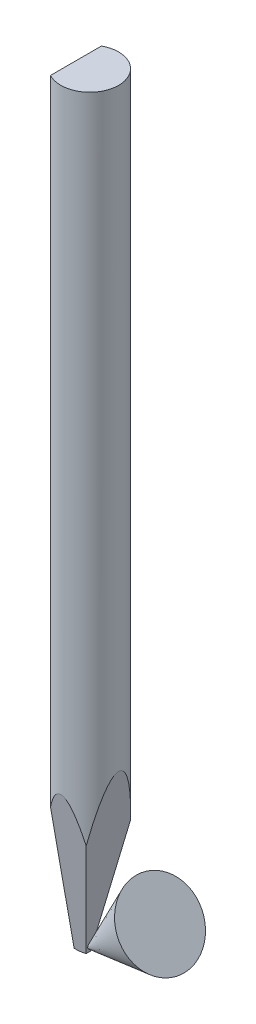
ISO-10303-21;
HEADER;
FILE_DESCRIPTION(('STEP AP214'),'2;1');
FILE_NAME('part.step','',(''),(''),'','','');
FILE_SCHEMA(('AUTOMOTIVE_DESIGN { 1 0 10303 214 1 1 1 1 }'));
ENDSEC;
DATA;
#1=APPLICATION_CONTEXT('core data for automotive mechanical design processes');
#2=APPLICATION_PROTOCOL_DEFINITION('international standard','automotive_design',2000,#1);
#3=PRODUCT_CONTEXT('',#1,'mechanical');
#4=PRODUCT('Part','Part','',(#3));
#5=PRODUCT_RELATED_PRODUCT_CATEGORY('part','',(#4));
#6=PRODUCT_DEFINITION_FORMATION('','',#4);
#7=PRODUCT_DEFINITION_CONTEXT('part definition',#1,'design');
#8=PRODUCT_DEFINITION('design','',#6,#7);
#9=PRODUCT_DEFINITION_SHAPE('','',#8);
#10=(LENGTH_UNIT() NAMED_UNIT(*) SI_UNIT(.MILLI.,.METRE.));
#11=(NAMED_UNIT(*) PLANE_ANGLE_UNIT() SI_UNIT($,.RADIAN.));
#12=(NAMED_UNIT(*) SI_UNIT($,.STERADIAN.) SOLID_ANGLE_UNIT());
#13=UNCERTAINTY_MEASURE_WITH_UNIT(LENGTH_MEASURE(1.E-05),#10,'distance_accuracy_value','');
#14=(GEOMETRIC_REPRESENTATION_CONTEXT(3) GLOBAL_UNCERTAINTY_ASSIGNED_CONTEXT((#13)) GLOBAL_UNIT_ASSIGNED_CONTEXT((#10,
#11,#12)) REPRESENTATION_CONTEXT('',''));
#15=CARTESIAN_POINT('',(0.,0.,0.));
#16=DIRECTION('',(0.,0.,1.));
#17=DIRECTION('',(1.,0.,0.));
#18=AXIS2_PLACEMENT_3D('',#15,#16,#17);
#19=CARTESIAN_POINT('',(-0.200697368462363,0.0863600000000001,0.));
#20=DIRECTION('',(-0.529919264233209,-0.848048096156424,0.));
#21=DIRECTION('',(0.848048096156424,-0.529919264233209,0.));
#22=AXIS2_PLACEMENT_3D('',#19,#20,#21);
#23=CYLINDRICAL_SURFACE('',#22,0.03175);
#24=DIRECTION('',(-0.529919264233209,-0.848048096156424,0.));
#25=VECTOR('',#24,1.);
#26=CARTESIAN_POINT('',(-0.183148578935577,0.11444393382259,0.03175));
#27=LINE('',#26,#25);
#28=CARTESIAN_POINT('',(-0.200697368462363,0.0863600000000001,0.03175));
#29=VERTEX_POINT('',#28);
#30=CARTESIAN_POINT('',(-0.254661085693253,0.,0.03175));
#31=VERTEX_POINT('',#30);
#32=EDGE_CURVE('E130',#29,#31,#27,.T.);
#33=ORIENTED_EDGE('',*,*,#32,.F.);
#34=CARTESIAN_POINT('',(-0.200697368462363,0.0863600000000001,0.));
#35=DIRECTION('',(0.,-1.,0.));
#36=DIRECTION('',(-1.,0.,0.));
#37=AXIS2_PLACEMENT_3D('',#34,#35,#36);
#38=ELLIPSE('',#37,0.0374389143067467,0.03175);
#39=CARTESIAN_POINT('',(-0.200697368462363,0.0863600000000001,-0.03175));
#40=VERTEX_POINT('',#39);
#41=EDGE_CURVE('E61',#40,#29,#38,.F.);
#42=ORIENTED_EDGE('',*,*,#41,.F.);
#43=DIRECTION('',(0.529919264233209,0.848048096156424,0.));
#44=VECTOR('',#43,1.);
#45=CARTESIAN_POINT('',(-0.200697368462363,0.0863600000000001,-0.03175));
#46=LINE('',#45,#44);
#47=CARTESIAN_POINT('',(-0.254661085693253,0.,-0.03175));
#48=VERTEX_POINT('',#47);
#49=EDGE_CURVE('E133',#48,#40,#46,.T.);
#50=ORIENTED_EDGE('',*,*,#49,.F.);
#51=CARTESIAN_POINT('',(-0.254661085693253,0.,0.));
#52=DIRECTION('',(0.,1.,0.));
#53=DIRECTION('',(-1.,0.,0.));
#54=AXIS2_PLACEMENT_3D('',#51,#52,#53);
#55=ELLIPSE('',#54,0.0374389143067467,0.03175);
#56=EDGE_CURVE('E12',#31,#48,#55,.F.);
#57=ORIENTED_EDGE('',*,*,#56,.F.);
#58=EDGE_LOOP('',(#33,#42,#50,#57));
#59=FACE_BOUND('',#58,.T.);
#60=ADVANCED_FACE('F53',(#59),#23,.T.);
#61=CARTESIAN_POINT('',(-0.23813628276911,0.0863600000000001,0.03175));
#62=DIRECTION('',(0.,-1.,0.));
#63=DIRECTION('',(0.,0.,-1.));
#64=AXIS2_PLACEMENT_3D('',#61,#62,#63);
#65=PLANE('',#64);
#66=DIRECTION('',(-1.,0.,0.));
#67=VECTOR('',#66,1.);
#68=CARTESIAN_POINT('',(-0.23813628276911,0.0863600000000001,-0.03175));
#69=LINE('',#68,#67);
#70=CARTESIAN_POINT('',(-0.13716,0.0863600000000001,-0.03175));
#71=VERTEX_POINT('',#70);
#72=EDGE_CURVE('E105',#71,#40,#69,.T.);
#73=ORIENTED_EDGE('',*,*,#72,.T.);
#74=ORIENTED_EDGE('',*,*,#41,.T.);
#75=DIRECTION('',(-1.,0.,0.));
#76=VECTOR('',#75,1.);
#77=CARTESIAN_POINT('',(-0.23813628276911,0.0863600000000001,0.03175));
#78=LINE('',#77,#76);
#79=CARTESIAN_POINT('',(-0.13716,0.0863600000000001,0.03175));
#80=VERTEX_POINT('',#79);
#81=EDGE_CURVE('E135',#80,#29,#78,.T.);
#82=ORIENTED_EDGE('',*,*,#81,.F.);
#83=DIRECTION('',(0.,0.,-1.));
#84=VECTOR('',#83,1.);
#85=CARTESIAN_POINT('',(-0.13716,0.0863600000000001,0.03175));
#86=LINE('',#85,#84);
#87=CARTESIAN_POINT('',(-0.13716,0.0863600000000001,0.0253999999999999));
#88=VERTEX_POINT('',#87);
#89=EDGE_CURVE('E113',#80,#88,#86,.T.);
#90=ORIENTED_EDGE('',*,*,#89,.T.);
#91=CARTESIAN_POINT('',(-0.13716,0.0863600000000001,0.));
#92=DIRECTION('',(0.,1.,0.));
#93=DIRECTION('',(1.,0.,0.));
#94=AXIS2_PLACEMENT_3D('',#91,#92,#93);
#95=ELLIPSE('',#94,0.0412564388352619,0.0253999999999999);
#96=CARTESIAN_POINT('',(-0.13716,0.0863600000000001,-0.0253999999999983));
#97=VERTEX_POINT('',#96);
#98=EDGE_CURVE('E100',#88,#97,#95,.F.);
#99=ORIENTED_EDGE('',*,*,#98,.T.);
#100=EDGE_CURVE('E110',#97,#71,#86,.T.);
#101=ORIENTED_EDGE('',*,*,#100,.T.);
#102=EDGE_LOOP('',(#73,#74,#82,#90,#99,#101));
#103=FACE_BOUND('',#102,.T.);
#104=ADVANCED_FACE('F109',(#103),#65,.F.);
#105=CARTESIAN_POINT('',(-0.13716,0.,0.03175));
#106=DIRECTION('',(0.,1.,0.));
#107=DIRECTION('',(0.,0.,1.));
#108=AXIS2_PLACEMENT_3D('',#105,#106,#107);
#109=PLANE('',#108);
#110=DIRECTION('',(1.,0.,0.));
#111=VECTOR('',#110,1.);
#112=CARTESIAN_POINT('',(-0.13716,0.,0.03175));
#113=LINE('',#112,#111);
#114=CARTESIAN_POINT('',(-0.13716,0.,0.03175));
#115=VERTEX_POINT('',#114);
#116=EDGE_CURVE('E124',#31,#115,#113,.T.);
#117=ORIENTED_EDGE('',*,*,#116,.F.);
#118=ORIENTED_EDGE('',*,*,#56,.T.);
#119=DIRECTION('',(1.,0.,0.));
#120=VECTOR('',#119,1.);
#121=CARTESIAN_POINT('',(-0.13716,0.,-0.03175));
#122=LINE('',#121,#120);
#123=CARTESIAN_POINT('',(-0.13716,0.,-0.03175));
#124=VERTEX_POINT('',#123);
#125=EDGE_CURVE('E141',#48,#124,#122,.T.);
#126=ORIENTED_EDGE('',*,*,#125,.T.);
#127=DIRECTION('',(0.,0.,-1.));
#128=VECTOR('',#127,1.);
#129=CARTESIAN_POINT('',(-0.13716,0.,0.03175));
#130=LINE('',#129,#128);
#131=EDGE_CURVE('E123',#115,#124,#130,.T.);
#132=ORIENTED_EDGE('',*,*,#131,.F.);
#133=EDGE_LOOP('',(#117,#118,#126,#132));
#134=FACE_BOUND('',#133,.T.);
#135=ADVANCED_FACE('F145',(#134),#109,.F.);
#136=CARTESIAN_POINT('',(-0.13716,0.0863600000000001,0.03175));
#137=DIRECTION('',(-1.,0.,0.));
#138=DIRECTION('',(0.,0.,1.));
#139=AXIS2_PLACEMENT_3D('',#136,#137,#138);
#140=PLANE('',#139);
#141=ORIENTED_EDGE('',*,*,#100,.F.);
#142=CARTESIAN_POINT('',(-0.13716,0.08636,0.));
#143=DIRECTION('',(1.,0.,0.));
#144=DIRECTION('',(0.,1.,0.));
#145=AXIS2_PLACEMENT_3D('',#142,#143,#144);
#146=ELLIPSE('',#145,0.0322330626628433,0.0253999999999999);
#147=EDGE_CURVE('E96',#97,#88,#146,.F.);
#148=ORIENTED_EDGE('',*,*,#147,.T.);
#149=ORIENTED_EDGE('',*,*,#89,.F.);
#150=DIRECTION('',(0.,1.,0.));
#151=VECTOR('',#150,1.);
#152=CARTESIAN_POINT('',(-0.13716,0.0863600000000001,0.03175));
#153=LINE('',#152,#151);
#154=EDGE_CURVE('E121',#115,#80,#153,.T.);
#155=ORIENTED_EDGE('',*,*,#154,.F.);
#156=ORIENTED_EDGE('',*,*,#131,.T.);
#157=DIRECTION('',(0.,1.,0.));
#158=VECTOR('',#157,1.);
#159=CARTESIAN_POINT('',(-0.13716,0.0863600000000001,-0.03175));
#160=LINE('',#159,#158);
#161=EDGE_CURVE('E119',#124,#71,#160,.T.);
#162=ORIENTED_EDGE('',*,*,#161,.T.);
#163=EDGE_LOOP('',(#141,#148,#149,#155,#156,#162));
#164=FACE_BOUND('',#163,.T.);
#165=ADVANCED_FACE('F116',(#164),#140,.F.);
#166=CARTESIAN_POINT('',(0.,0.,0.03175));
#167=DIRECTION('',(0.,0.,-1.));
#168=DIRECTION('',(-1.,0.,0.));
#169=AXIS2_PLACEMENT_3D('',#166,#167,#168);
#170=PLANE('',#169);
#171=ORIENTED_EDGE('',*,*,#81,.T.);
#172=ORIENTED_EDGE('',*,*,#32,.T.);
#173=ORIENTED_EDGE('',*,*,#116,.T.);
#174=ORIENTED_EDGE('',*,*,#154,.T.);
#175=EDGE_LOOP('',(#171,#172,#173,#174));
#176=FACE_BOUND('',#175,.T.);
#177=ADVANCED_FACE('F137',(#176),#170,.F.);
#178=CARTESIAN_POINT('',(0.,0.,-0.03175));
#179=DIRECTION('',(0.,0.,-1.));
#180=DIRECTION('',(-1.,0.,0.));
#181=AXIS2_PLACEMENT_3D('',#178,#179,#180);
#182=PLANE('',#181);
#183=ORIENTED_EDGE('',*,*,#125,.F.);
#184=ORIENTED_EDGE('',*,*,#49,.T.);
#185=ORIENTED_EDGE('',*,*,#72,.F.);
#186=ORIENTED_EDGE('',*,*,#161,.F.);
#187=EDGE_LOOP('',(#183,#184,#185,#186));
#188=FACE_BOUND('',#187,.T.);
#189=ADVANCED_FACE('F147',(#188),#182,.T.);
#190=CARTESIAN_POINT('',(-0.321978727638829,-0.0580362154134752,0.));
#191=DIRECTION('',(0.788010753606725,0.615661475325654,0.));
#192=DIRECTION('',(-0.615661475325654,0.788010753606725,0.));
#193=AXIS2_PLACEMENT_3D('',#190,#191,#192);
#194=CYLINDRICAL_SURFACE('',#193,0.0253999999999999);
#195=ORIENTED_EDGE('',*,*,#147,.F.);
#196=ORIENTED_EDGE('',*,*,#98,.F.);
#197=EDGE_LOOP('',(#195,#196));
#198=FACE_BOUND('',#197,.T.);
#199=CARTESIAN_POINT('',(-0.04377893297405,0.159317285455234,0.));
#200=DIRECTION('',(0.788010753606725,0.615661475325654,0.));
#201=DIRECTION('',(-0.615661475325654,0.788010753606725,0.));
#202=AXIS2_PLACEMENT_3D('',#199,#200,#201);
#203=CIRCLE('',#202,0.0253999999999999);
#204=CARTESIAN_POINT('',(-0.0594167344473216,0.179332758596845,0.));
#205=VERTEX_POINT('',#204);
#206=EDGE_CURVE('E114',#205,#205,#203,.T.);
#207=ORIENTED_EDGE('',*,*,#206,.F.);
#208=EDGE_LOOP('',(#207));
#209=FACE_BOUND('',#208,.T.);
#210=ADVANCED_FACE('F98',(#198,#209),#194,.T.);
#211=CARTESIAN_POINT('',(-0.04377893297405,0.159317285455234,0.));
#212=DIRECTION('',(0.788010753606725,0.615661475325654,0.));
#213=DIRECTION('',(-0.615661475325654,0.788010753606725,0.));
#214=AXIS2_PLACEMENT_3D('',#211,#212,#213);
#215=CONICAL_SURFACE('',#214,0.0253999999999999,0.392699081698725);
#216=CARTESIAN_POINT('',(1.926244010989,1.69846789546199,0.));
#217=DIRECTION('',(0.788010753606725,0.615661475325654,0.));
#218=DIRECTION('',(-0.615661475325654,0.788010753606725,0.));
#219=AXIS2_PLACEMENT_3D('',#216,#217,#218);
#220=CIRCLE('',#219,1.06093183486493);
#221=CARTESIAN_POINT('',(1.2730691523161,2.53449359017927,0.));
#222=VERTEX_POINT('',#221);
#223=EDGE_CURVE('E244',#222,#222,#220,.T.);
#224=CARTESIAN_POINT('',(1.2730691523161,2.53449359017927,0.));
#225=CARTESIAN_POINT('',(1.25918909099565,2.50996066485029,0.));
#226=CARTESIAN_POINT('',(1.2453090296752,2.4854277395213,0.));
#227=CARTESIAN_POINT('',(1.21754890703429,2.43636188886334,0.));
#228=CARTESIAN_POINT('',(1.20366884571384,2.41182896353435,0.));
#229=CARTESIAN_POINT('',(1.17590872307293,2.36276311287639,0.));
#230=CARTESIAN_POINT('',(1.16202866175248,2.3382301875474,0.));
#231=CARTESIAN_POINT('',(1.13426853911158,2.28916433688944,0.));
#232=CARTESIAN_POINT('',(1.12038847779112,2.26463141156045,0.));
#233=CARTESIAN_POINT('',(1.09262835515022,2.21556556090248,0.));
#234=CARTESIAN_POINT('',(1.07874829382977,2.1910326355735,0.));
#235=CARTESIAN_POINT('',(1.05098817118886,2.14196678491553,0.));
#236=CARTESIAN_POINT('',(1.03710810986841,2.11743385958655,0.));
#237=CARTESIAN_POINT('',(1.00934798722751,2.06836800892858,0.));
#238=CARTESIAN_POINT('',(0.995467925907054,2.0438350835996,0.));
#239=CARTESIAN_POINT('',(0.96770780326615,1.99476923294163,0.));
#240=CARTESIAN_POINT('',(0.953827741945697,1.97023630761265,0.));
#241=CARTESIAN_POINT('',(0.926067619304793,1.92117045695468,0.));
#242=CARTESIAN_POINT('',(0.91218755798434,1.8966375316257,0.));
#243=CARTESIAN_POINT('',(0.884427435343435,1.84757168096773,0.));
#244=CARTESIAN_POINT('',(0.870547374022983,1.82303875563875,0.));
#245=CARTESIAN_POINT('',(0.842787251382079,1.77397290498078,0.));
#246=CARTESIAN_POINT('',(0.828907190061626,1.7494399796518,0.));
#247=CARTESIAN_POINT('',(0.801147067420722,1.70037412899383,0.));
#248=CARTESIAN_POINT('',(0.787267006100269,1.67584120366485,0.));
#249=CARTESIAN_POINT('',(0.759506883459365,1.62677535300688,0.));
#250=CARTESIAN_POINT('',(0.745626822138913,1.60224242767789,0.));
#251=CARTESIAN_POINT('',(0.717866699498008,1.55317657701993,0.));
#252=CARTESIAN_POINT('',(0.703986638177555,1.52864365169094,0.));
#253=CARTESIAN_POINT('',(0.676226515536651,1.47957780103298,0.));
#254=CARTESIAN_POINT('',(0.662346454216198,1.45504487570399,0.));
#255=CARTESIAN_POINT('',(0.634586331575294,1.40597902504603,0.));
#256=CARTESIAN_POINT('',(0.620706270254842,1.38144609971704,0.));
#257=CARTESIAN_POINT('',(0.592946147613937,1.33238024905907,0.));
#258=CARTESIAN_POINT('',(0.579066086293485,1.30784732373009,0.));
#259=CARTESIAN_POINT('',(0.55130596365258,1.25878147307212,0.));
#260=CARTESIAN_POINT('',(0.537425902332128,1.23424854774314,0.));
#261=CARTESIAN_POINT('',(0.509665779691223,1.18518269708517,0.));
#262=CARTESIAN_POINT('',(0.495785718370771,1.16064977175619,0.));
#263=CARTESIAN_POINT('',(0.468025595729866,1.11158392109822,0.));
#264=CARTESIAN_POINT('',(0.454145534409414,1.08705099576924,0.));
#265=CARTESIAN_POINT('',(0.426385411768509,1.03798514511127,0.));
#266=CARTESIAN_POINT('',(0.412505350448057,1.01345221978229,0.));
#267=CARTESIAN_POINT('',(0.384745227807152,0.964386369124321,0.));
#268=CARTESIAN_POINT('',(0.3708651664867,0.939853443795337,0.));
#269=CARTESIAN_POINT('',(0.343105043845795,0.89078759313737,0.));
#270=CARTESIAN_POINT('',(0.329224982525343,0.866254667808386,0.));
#271=CARTESIAN_POINT('',(0.301464859884438,0.817188817150419,0.));
#272=CARTESIAN_POINT('',(0.287584798563986,0.792655891821435,0.));
#273=CARTESIAN_POINT('',(0.259824675923082,0.743590041163468,0.));
#274=CARTESIAN_POINT('',(0.245944614602629,0.719057115834485,0.));
#275=CARTESIAN_POINT('',(0.218184491961725,0.669991265176517,0.));
#276=CARTESIAN_POINT('',(0.204304430641272,0.645458339847534,0.));
#277=CARTESIAN_POINT('',(0.176544308000368,0.596392489189567,0.));
#278=CARTESIAN_POINT('',(0.162664246679915,0.571859563860583,0.));
#279=CARTESIAN_POINT('',(0.134904124039011,0.522793713202616,0.));
#280=CARTESIAN_POINT('',(0.121024062718558,0.498260787873632,0.));
#281=CARTESIAN_POINT('',(0.0932639400776539,0.449194937215665,0.));
#282=CARTESIAN_POINT('',(0.0793838787572015,0.424662011886681,0.));
#283=CARTESIAN_POINT('',(0.0516237561162968,0.375596161228714,0.));
#284=CARTESIAN_POINT('',(0.0377436947958445,0.35106323589973,0.));
#285=CARTESIAN_POINT('',(0.00998357215493992,0.301997385241763,0.));
#286=CARTESIAN_POINT('',(-0.00389648916551234,0.27746445991278,0.));
#287=CARTESIAN_POINT('',(-0.0316566118064169,0.228398609254813,0.));
#288=CARTESIAN_POINT('',(-0.0455366731268693,0.203865683925829,0.));
#289=CARTESIAN_POINT('',(-0.0594167344473216,0.179332758596845,0.));
#290=B_SPLINE_CURVE_WITH_KNOTS('',3,(#224,#225,#226,#227,#228,#229,#230,#231,#232,#233,#234,
#235,#236,#237,#238,#239,#240,#241,#242,#243,#244,#245,#246,#247,#248,#249,#250,#251,#252,#253,
#254,#255,#256,#257,#258,#259,#260,#261,#262,#263,#264,#265,#266,#267,#268,#269,#270,#271,#272,
#273,#274,#275,#276,#277,#278,#279,#280,#281,#282,#283,#284,#285,#286,#287,#288,#289),
.UNSPECIFIED.,.F.,.F.,(4,2,2,2,2,2,2,2,2,2,2,2,2,2,2,2,2,2,2,2,2,2,2,2,2,2,2,2,2,2,2,2,4),(0.,
0.084561721524062,0.169123443048124,0.253685164572186,0.338246886096248,0.42280860762031,
0.507370329144372,0.591932050668434,0.676493772192496,0.761055493716558,0.84561721524062,
0.930178936764682,1.01474065828874,1.09930237981281,1.18386410133687,1.26842582286093,
1.35298754438499,1.43754926590905,1.52211098743312,1.60667270895718,1.69123443048124,
1.7757961520053,1.86035787352937,1.94491959505343,2.02948131657749,2.11404303810155,
2.19860475962561,2.28316648114968,2.36772820267374,2.4522899241978,2.53685164572186,
2.62141336724592,2.70597508876999),.UNSPECIFIED.);
#291=EDGE_CURVE('BSEAM154',#222,#205,#290,.T.);
#292=ORIENTED_EDGE('',*,*,#223,.F.);
#293=ORIENTED_EDGE('',*,*,#206,.T.);
#294=ORIENTED_EDGE('',*,*,#291,.T.);
#295=ORIENTED_EDGE('',*,*,#291,.F.);
#296=EDGE_LOOP('',(#292,#294,#293,#295));
#297=FACE_BOUND('',#296,.T.);
#298=ADVANCED_FACE('F154',(#297),#215,.T.);
#299=CARTESIAN_POINT('',(1.926244010989,1.69846789546199,0.));
#300=DIRECTION('',(0.788010753606725,0.615661475325654,0.));
#301=DIRECTION('',(-0.615661475325654,0.788010753606725,0.));
#302=AXIS2_PLACEMENT_3D('',#299,#300,#301);
#303=PLANE('',#302);
#304=ORIENTED_EDGE('',*,*,#223,.T.);
#305=EDGE_LOOP('',(#304));
#306=FACE_BOUND('',#305,.T.);
#307=ADVANCED_FACE('F212',(#306),#303,.T.);
#308=CLOSED_SHELL('',(#60,#104,#135,#165,#177,#189,#210,#298,#307));
#309=MANIFOLD_SOLID_BREP('B2',#308);
#310=CARTESIAN_POINT('',(0.,21.0312,0.));
#311=DIRECTION('',(0.,-1.,0.));
#312=DIRECTION('',(0.,0.,-1.));
#313=AXIS2_PLACEMENT_3D('',#310,#311,#312);
#314=CYLINDRICAL_SURFACE('',#313,0.792479999999998);
#315=CARTESIAN_POINT('',(0.,-0.288101116436578,0.));
#316=DIRECTION('',(0.,-0.173648177666931,0.984807753012208));
#317=DIRECTION('',(0.,-0.984807753012208,-0.173648177666931));
#318=AXIS2_PLACEMENT_3D('',#315,#316,#317);
#319=ELLIPSE('',#318,4.56371043248163,0.792479999999998);
#320=CARTESIAN_POINT('',(0.510025990868476,3.15179213433782,0.60654599086848));
#321=VERTEX_POINT('',#320);
#322=CARTESIAN_POINT('',(-0.37592,3.66844093071414,0.69764511322018));
#323=VERTEX_POINT('',#322);
#324=EDGE_CURVE('E325',#321,#323,#319,.T.);
#325=ORIENTED_EDGE('',*,*,#324,.F.);
#326=CARTESIAN_POINT('',(0.,0.259291004792921,0.));
#327=DIRECTION('',(-0.984807753012208,0.173648177666931,0.));
#328=DIRECTION('',(-0.173648177666931,-0.984807753012208,0.));
#329=AXIS2_PLACEMENT_3D('',#326,#327,#328);
#330=ELLIPSE('',#329,4.56371043248164,0.792479999999998);
#331=CARTESIAN_POINT('',(0.510025990868476,3.15179213433782,-0.60654599086848));
#332=VERTEX_POINT('',#331);
#333=EDGE_CURVE('E379',#321,#332,#330,.T.);
#334=ORIENTED_EDGE('',*,*,#333,.T.);
#335=CARTESIAN_POINT('',(0.,-0.288101116436578,0.));
#336=DIRECTION('',(0.,-0.173648177666931,-0.984807753012208));
#337=DIRECTION('',(0.,-0.984807753012208,0.173648177666931));
#338=AXIS2_PLACEMENT_3D('',#335,#336,#337);
#339=ELLIPSE('',#338,4.56371043248163,0.792479999999998);
#340=CARTESIAN_POINT('',(-0.37592,3.66844093071414,-0.69764511322018));
#341=VERTEX_POINT('',#340);
#342=EDGE_CURVE('E388',#341,#332,#339,.T.);
#343=ORIENTED_EDGE('',*,*,#342,.F.);
#344=DIRECTION('',(0.,-1.,0.));
#345=VECTOR('',#344,1.);
#346=CARTESIAN_POINT('',(-0.37592,21.0312,-0.69764511322018));
#347=LINE('',#346,#345);
#348=CARTESIAN_POINT('',(-0.37592,21.0312,-0.69764511322018));
#349=VERTEX_POINT('',#348);
#350=EDGE_CURVE('E331',#349,#341,#347,.T.);
#351=ORIENTED_EDGE('',*,*,#350,.F.);
#352=CARTESIAN_POINT('',(0.,21.0312,0.));
#353=DIRECTION('',(0.,1.,0.));
#354=DIRECTION('',(0.,0.,1.));
#355=AXIS2_PLACEMENT_3D('',#352,#353,#354);
#356=CIRCLE('',#355,0.792479999999998);
#357=CARTESIAN_POINT('',(-0.37592,21.0312,0.69764511322018));
#358=VERTEX_POINT('',#357);
#359=EDGE_CURVE('E336',#358,#349,#356,.T.);
#360=ORIENTED_EDGE('',*,*,#359,.F.);
#361=DIRECTION('',(0.,-1.,0.));
#362=VECTOR('',#361,1.);
#363=CARTESIAN_POINT('',(-0.37592,21.0312,0.69764511322018));
#364=LINE('',#363,#362);
#365=EDGE_CURVE('E392',#323,#358,#364,.F.);
#366=ORIENTED_EDGE('',*,*,#365,.F.);
#367=EDGE_LOOP('',(#325,#334,#343,#351,#360,#366));
#368=FACE_BOUND('',#367,.T.);
#369=ADVANCED_FACE('F254',(#368),#314,.T.);
#370=CARTESIAN_POINT('',(-0.37592,21.0312,-1.04648));
#371=DIRECTION('',(-1.,0.,0.));
#372=DIRECTION('',(0.,0.,1.));
#373=AXIS2_PLACEMENT_3D('',#370,#371,#372);
#374=PLANE('',#373);
#375=CARTESIAN_POINT('',(-0.375919999999998,-0.33655,0.));
#376=DIRECTION('',(-1.,0.,0.));
#377=DIRECTION('',(0.,0.,1.));
#378=AXIS2_PLACEMENT_3D('',#375,#376,#377);
#379=CIRCLE('',#378,0.34036);
#380=CARTESIAN_POINT('',(-0.37592,0.,0.0507920612593778));
#381=VERTEX_POINT('',#380);
#382=CARTESIAN_POINT('',(-0.375920000000001,0.,-0.0507920612593777));
#383=VERTEX_POINT('',#382);
#384=EDGE_CURVE('E305',#381,#383,#379,.T.);
#385=ORIENTED_EDGE('',*,*,#384,.F.);
#386=DIRECTION('',(0.,0.984807753012208,0.173648177666931));
#387=VECTOR('',#386,1.);
#388=CARTESIAN_POINT('',(-0.37592,20.2093857917021,3.6142599786234));
#389=LINE('',#388,#387);
#390=EDGE_CURVE('E333',#381,#323,#389,.T.);
#391=ORIENTED_EDGE('',*,*,#390,.T.);
#392=ORIENTED_EDGE('',*,*,#365,.T.);
#393=DIRECTION('',(0.,0.,-1.));
#394=VECTOR('',#393,1.);
#395=CARTESIAN_POINT('',(-0.37592,21.0312,-1.04648));
#396=LINE('',#395,#394);
#397=EDGE_CURVE('E390',#358,#349,#396,.T.);
#398=ORIENTED_EDGE('',*,*,#397,.T.);
#399=ORIENTED_EDGE('',*,*,#350,.T.);
#400=DIRECTION('',(0.,-0.984807753012208,0.173648177666931));
#401=VECTOR('',#400,1.);
#402=CARTESIAN_POINT('',(-0.37592,20.5673030312895,-3.67737044482337));
#403=LINE('',#402,#401);
#404=EDGE_CURVE('E322',#341,#383,#403,.T.);
#405=ORIENTED_EDGE('',*,*,#404,.T.);
#406=EDGE_LOOP('',(#385,#391,#392,#398,#399,#405));
#407=FACE_BOUND('',#406,.T.);
#408=ADVANCED_FACE('F329',(#407),#374,.T.);
#409=CARTESIAN_POINT('',(0.,21.0312,0.));
#410=DIRECTION('',(0.,1.,0.));
#411=DIRECTION('',(0.,0.,1.));
#412=AXIS2_PLACEMENT_3D('',#409,#410,#411);
#413=PLANE('',#412);
#414=ORIENTED_EDGE('',*,*,#359,.T.);
#415=ORIENTED_EDGE('',*,*,#397,.F.);
#416=EDGE_LOOP('',(#414,#415));
#417=FACE_BOUND('',#416,.T.);
#418=ADVANCED_FACE('F360',(#417),#413,.T.);
#419=CARTESIAN_POINT('',(26.8738719491216,0.,0.0508));
#420=DIRECTION('',(0.,-0.173648177666931,0.984807753012208));
#421=DIRECTION('',(0.,-0.984807753012208,-0.173648177666931));
#422=AXIS2_PLACEMENT_3D('',#419,#420,#421);
#423=PLANE('',#422);
#424=DIRECTION('',(-0.973604476189699,-0.224774304289668,-0.0396337744162431));
#425=VECTOR('',#424,1.);
#426=CARTESIAN_POINT('',(25.4614577174064,5.93336277595077,1.0970119437314));
#427=LINE('',#426,#425);
#428=CARTESIAN_POINT('',(-0.0375281971963556,0.0464580223102137,0.0589918028036466));
#429=VERTEX_POINT('',#428);
#430=CARTESIAN_POINT('',(-0.238759999999998,0.,0.0507920612593778));
#431=VERTEX_POINT('',#430);
#432=EDGE_CURVE('E269',#429,#431,#427,.T.);
#433=ORIENTED_EDGE('',*,*,#432,.F.);
#434=DIRECTION('',(-0.171087869746036,-0.970287525247814,-0.171087869746036));
#435=VECTOR('',#434,1.);
#436=CARTESIAN_POINT('',(0.742244968889038,4.46877140255603,0.838764968889043));
#437=LINE('',#436,#435);
#438=EDGE_CURVE('E273',#321,#429,#437,.T.);
#439=ORIENTED_EDGE('',*,*,#438,.F.);
#440=ORIENTED_EDGE('',*,*,#324,.T.);
#441=ORIENTED_EDGE('',*,*,#390,.F.);
#442=CARTESIAN_POINT('',(-0.238759999999994,0.,0.0507841225187557));
#443=DIRECTION('',(-1.,0.,0.));
#444=VECTOR('',#443,1.);
#445=LINE('',#442,#444);
#446=EDGE_CURVE('E310',#431,#381,#445,.T.);
#447=ORIENTED_EDGE('',*,*,#446,.F.);
#448=EDGE_LOOP('',(#433,#439,#440,#441,#447));
#449=FACE_BOUND('',#448,.T.);
#450=ADVANCED_FACE('F350',(#449),#423,.T.);
#451=CARTESIAN_POINT('',(26.8738719491216,0.,-0.0508));
#452=DIRECTION('',(0.,-0.173648177666931,-0.984807753012208));
#453=DIRECTION('',(0.,0.984807753012208,-0.173648177666931));
#454=AXIS2_PLACEMENT_3D('',#451,#452,#453);
#455=PLANE('',#454);
#456=DIRECTION('',(0.973604476189699,0.224774304289668,-0.0396337744162431));
#457=VECTOR('',#456,1.);
#458=CARTESIAN_POINT('',(25.4614577174064,5.93336277595077,-1.0970119437314));
#459=LINE('',#458,#457);
#460=CARTESIAN_POINT('',(-0.238759999999998,0.,-0.0507920612593777));
#461=VERTEX_POINT('',#460);
#462=CARTESIAN_POINT('',(-0.0375281971963556,0.0464580223102137,-0.0589918028036466));
#463=VERTEX_POINT('',#462);
#464=EDGE_CURVE('E262',#461,#463,#459,.T.);
#465=ORIENTED_EDGE('',*,*,#464,.F.);
#466=CARTESIAN_POINT('',(-0.238760000000001,0.,-0.0507999999999999));
#467=DIRECTION('',(-1.,0.,0.));
#468=VECTOR('',#467,1.);
#469=LINE('',#466,#468);
#470=EDGE_CURVE('E308',#461,#383,#469,.T.);
#471=ORIENTED_EDGE('',*,*,#470,.T.);
#472=ORIENTED_EDGE('',*,*,#404,.F.);
#473=ORIENTED_EDGE('',*,*,#342,.T.);
#474=DIRECTION('',(0.171087869746036,0.970287525247814,-0.171087869746036));
#475=VECTOR('',#474,1.);
#476=CARTESIAN_POINT('',(0.742244968889038,4.46877140255603,-0.838764968889043));
#477=LINE('',#476,#475);
#478=EDGE_CURVE('E332',#463,#332,#477,.T.);
#479=ORIENTED_EDGE('',*,*,#478,.F.);
#480=EDGE_LOOP('',(#465,#471,#472,#473,#479));
#481=FACE_BOUND('',#480,.T.);
#482=ADVANCED_FACE('F321',(#481),#455,.T.);
#483=CARTESIAN_POINT('',(-0.23876,0.,27.2760283406468));
#484=DIRECTION('',(-0.224951054343865,0.974370064785235,0.));
#485=DIRECTION('',(-0.974370064785235,-0.224951054343865,0.));
#486=AXIS2_PLACEMENT_3D('',#483,#484,#485);
#487=PLANE('',#486);
#488=ORIENTED_EDGE('',*,*,#432,.T.);
#489=CARTESIAN_POINT('',(-1.69651820549033,-0.33655,0.));
#490=DIRECTION('',(-0.224951054343865,0.974370064785235,0.));
#491=DIRECTION('',(-0.974370064785235,-0.224951054343865,0.));
#492=AXIS2_PLACEMENT_3D('',#489,#490,#491);
#493=ELLIPSE('',#492,1.5130402522129,0.34036);
#494=EDGE_CURVE('E51',#431,#461,#493,.T.);
#495=ORIENTED_EDGE('',*,*,#494,.T.);
#496=ORIENTED_EDGE('',*,*,#464,.T.);
#497=DIRECTION('',(0.,0.,-1.));
#498=VECTOR('',#497,1.);
#499=CARTESIAN_POINT('',(-0.0375281971963536,0.046458022310214,27.2760283406468));
#500=LINE('',#499,#498);
#501=EDGE_CURVE('E316',#429,#463,#500,.T.);
#502=ORIENTED_EDGE('',*,*,#501,.F.);
#503=EDGE_LOOP('',(#488,#495,#496,#502));
#504=FACE_BOUND('',#503,.T.);
#505=ADVANCED_FACE('F361',(#504),#487,.F.);
#506=CARTESIAN_POINT('',(-0.0375281971963536,0.046458022310214,27.2760283406468));
#507=DIRECTION('',(-0.984807753012208,0.173648177666931,0.));
#508=DIRECTION('',(-0.173648177666931,-0.984807753012208,0.));
#509=AXIS2_PLACEMENT_3D('',#506,#507,#508);
#510=PLANE('',#509);
#511=ORIENTED_EDGE('',*,*,#333,.F.);
#512=ORIENTED_EDGE('',*,*,#438,.T.);
#513=ORIENTED_EDGE('',*,*,#501,.T.);
#514=ORIENTED_EDGE('',*,*,#478,.T.);
#515=EDGE_LOOP('',(#511,#512,#513,#514));
#516=FACE_BOUND('',#515,.T.);
#517=ADVANCED_FACE('F378',(#516),#510,.F.);
#518=CARTESIAN_POINT('',(26.7024219491216,-0.33655,0.));
#519=DIRECTION('',(-1.,0.,0.));
#520=DIRECTION('',(0.,0.,1.));
#521=AXIS2_PLACEMENT_3D('',#518,#519,#520);
#522=CYLINDRICAL_SURFACE('',#521,0.34036);
#523=ORIENTED_EDGE('',*,*,#446,.T.);
#524=ORIENTED_EDGE('',*,*,#384,.T.);
#525=ORIENTED_EDGE('',*,*,#470,.F.);
#526=ORIENTED_EDGE('',*,*,#494,.F.);
#527=EDGE_LOOP('',(#523,#524,#525,#526));
#528=FACE_BOUND('',#527,.T.);
#529=ADVANCED_FACE('F307',(#528),#522,.F.);
#530=CLOSED_SHELL('',(#369,#408,#418,#450,#482,#505,#517,#529));
#531=MANIFOLD_SOLID_BREP('B6',#530);
#532=ADVANCED_BREP_SHAPE_REPRESENTATION('',(#18,#309,#531),#14);
#533=SHAPE_DEFINITION_REPRESENTATION(#9,#532);
ENDSEC;
END-ISO-10303-21;
